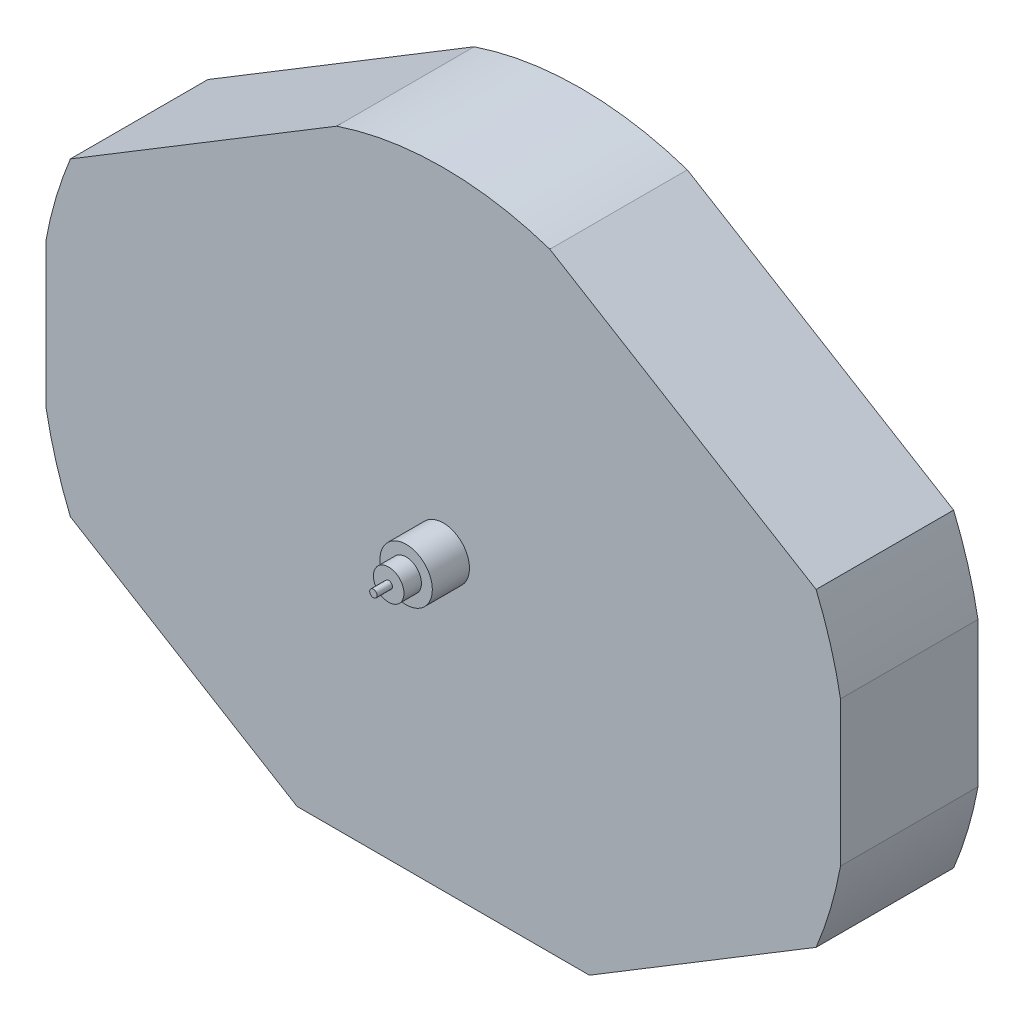
ISO-10303-21;
HEADER;
FILE_DESCRIPTION(('STEP AP214'),'2;1');
FILE_NAME('part.step','',(''),(''),'','','');
FILE_SCHEMA(('AUTOMOTIVE_DESIGN { 1 0 10303 214 1 1 1 1 }'));
ENDSEC;
DATA;
#1=APPLICATION_CONTEXT('core data for automotive mechanical design processes');
#2=APPLICATION_PROTOCOL_DEFINITION('international standard','automotive_design',2000,#1);
#3=PRODUCT_CONTEXT('',#1,'mechanical');
#4=PRODUCT('Part','Part','',(#3));
#5=PRODUCT_RELATED_PRODUCT_CATEGORY('part','',(#4));
#6=PRODUCT_DEFINITION_FORMATION('','',#4);
#7=PRODUCT_DEFINITION_CONTEXT('part definition',#1,'design');
#8=PRODUCT_DEFINITION('design','',#6,#7);
#9=PRODUCT_DEFINITION_SHAPE('','',#8);
#10=(LENGTH_UNIT() NAMED_UNIT(*) SI_UNIT(.MILLI.,.METRE.));
#11=(NAMED_UNIT(*) PLANE_ANGLE_UNIT() SI_UNIT($,.RADIAN.));
#12=(NAMED_UNIT(*) SI_UNIT($,.STERADIAN.) SOLID_ANGLE_UNIT());
#13=UNCERTAINTY_MEASURE_WITH_UNIT(LENGTH_MEASURE(1.E-05),#10,'distance_accuracy_value','');
#14=(GEOMETRIC_REPRESENTATION_CONTEXT(3) GLOBAL_UNCERTAINTY_ASSIGNED_CONTEXT((#13)) GLOBAL_UNIT_ASSIGNED_CONTEXT((#10,
#11,#12)) REPRESENTATION_CONTEXT('',''));
#15=CARTESIAN_POINT('',(0.,0.,0.));
#16=DIRECTION('',(0.,0.,1.));
#17=DIRECTION('',(1.,0.,0.));
#18=AXIS2_PLACEMENT_3D('',#15,#16,#17);
#19=CARTESIAN_POINT('',(0.,0.,3.15));
#20=DIRECTION('',(0.,0.,-1.));
#21=DIRECTION('',(-1.,0.,0.));
#22=AXIS2_PLACEMENT_3D('',#19,#20,#21);
#23=CYLINDRICAL_SURFACE('',#22,9.25);
#24=CARTESIAN_POINT('',(0.,0.,0.));
#25=DIRECTION('',(0.,0.,1.));
#26=DIRECTION('',(1.,0.,0.));
#27=AXIS2_PLACEMENT_3D('',#24,#25,#26);
#28=CIRCLE('',#27,9.25);
#29=CARTESIAN_POINT('',(9.1,1.6590660023037,0.));
#30=VERTEX_POINT('',#29);
#31=CARTESIAN_POINT('',(8.54166260162505,3.55,0.));
#32=VERTEX_POINT('',#31);
#33=EDGE_CURVE('E165',#30,#32,#28,.T.);
#34=ORIENTED_EDGE('',*,*,#33,.T.);
#35=DIRECTION('',(0.,0.,-1.));
#36=VECTOR('',#35,1.);
#37=CARTESIAN_POINT('',(8.54166260162505,3.55,3.15));
#38=LINE('',#37,#36);
#39=CARTESIAN_POINT('',(8.54166260162505,3.55,3.15));
#40=VERTEX_POINT('',#39);
#41=EDGE_CURVE('E45',#40,#32,#38,.T.);
#42=ORIENTED_EDGE('',*,*,#41,.F.);
#43=CARTESIAN_POINT('',(0.,0.,3.15));
#44=DIRECTION('',(0.,0.,1.));
#45=DIRECTION('',(1.,0.,0.));
#46=AXIS2_PLACEMENT_3D('',#43,#44,#45);
#47=CIRCLE('',#46,9.25);
#48=CARTESIAN_POINT('',(9.1,1.6590660023037,3.15));
#49=VERTEX_POINT('',#48);
#50=EDGE_CURVE('E183',#49,#40,#47,.T.);
#51=ORIENTED_EDGE('',*,*,#50,.F.);
#52=DIRECTION('',(0.,0.,-1.));
#53=VECTOR('',#52,1.);
#54=CARTESIAN_POINT('',(9.1,1.6590660023037,3.15));
#55=LINE('',#54,#53);
#56=EDGE_CURVE('E158',#49,#30,#55,.T.);
#57=ORIENTED_EDGE('',*,*,#56,.T.);
#58=EDGE_LOOP('',(#34,#42,#51,#57));
#59=FACE_BOUND('',#58,.T.);
#60=ADVANCED_FACE('F39',(#59),#23,.T.);
#61=CARTESIAN_POINT('',(2.44131112314674,7.25,3.15));
#62=DIRECTION('',(-0.518590479698631,-0.855022756636303,0.));
#63=DIRECTION('',(0.855022756636304,-0.518590479698632,0.));
#64=AXIS2_PLACEMENT_3D('',#61,#62,#63);
#65=PLANE('',#64);
#66=DIRECTION('',(-0.855022756636303,0.518590479698632,0.));
#67=VECTOR('',#66,1.);
#68=CARTESIAN_POINT('',(2.44131112314674,7.25,0.));
#69=LINE('',#68,#67);
#70=CARTESIAN_POINT('',(2.44131112314674,7.25,0.));
#71=VERTEX_POINT('',#70);
#72=EDGE_CURVE('E164',#32,#71,#69,.T.);
#73=ORIENTED_EDGE('',*,*,#72,.T.);
#74=DIRECTION('',(0.,0.,-1.));
#75=VECTOR('',#74,1.);
#76=CARTESIAN_POINT('',(2.44131112314674,7.25,3.15));
#77=LINE('',#76,#75);
#78=CARTESIAN_POINT('',(2.44131112314674,7.25,3.15));
#79=VERTEX_POINT('',#78);
#80=EDGE_CURVE('E206',#79,#71,#77,.T.);
#81=ORIENTED_EDGE('',*,*,#80,.F.);
#82=DIRECTION('',(-0.855022756636303,0.518590479698632,0.));
#83=VECTOR('',#82,1.);
#84=CARTESIAN_POINT('',(2.44131112314674,7.25,3.15));
#85=LINE('',#84,#83);
#86=EDGE_CURVE('E114',#40,#79,#85,.T.);
#87=ORIENTED_EDGE('',*,*,#86,.F.);
#88=ORIENTED_EDGE('',*,*,#41,.T.);
#89=EDGE_LOOP('',(#73,#81,#87,#88));
#90=FACE_BOUND('',#89,.T.);
#91=ADVANCED_FACE('F264',(#90),#65,.F.);
#92=CARTESIAN_POINT('',(0.,0.,3.15));
#93=DIRECTION('',(0.,0.,-1.));
#94=DIRECTION('',(-1.,0.,0.));
#95=AXIS2_PLACEMENT_3D('',#92,#93,#94);
#96=CYLINDRICAL_SURFACE('',#95,7.65);
#97=CARTESIAN_POINT('',(0.,0.,0.));
#98=DIRECTION('',(0.,0.,1.));
#99=DIRECTION('',(1.,0.,0.));
#100=AXIS2_PLACEMENT_3D('',#97,#98,#99);
#101=CIRCLE('',#100,7.65);
#102=CARTESIAN_POINT('',(-2.44131112314674,7.25,0.));
#103=VERTEX_POINT('',#102);
#104=EDGE_CURVE('E169',#71,#103,#101,.T.);
#105=ORIENTED_EDGE('',*,*,#104,.T.);
#106=DIRECTION('',(0.,0.,-1.));
#107=VECTOR('',#106,1.);
#108=CARTESIAN_POINT('',(-2.44131112314674,7.25,3.15));
#109=LINE('',#108,#107);
#110=CARTESIAN_POINT('',(-2.44131112314674,7.25,3.15));
#111=VERTEX_POINT('',#110);
#112=EDGE_CURVE('E204',#111,#103,#109,.T.);
#113=ORIENTED_EDGE('',*,*,#112,.F.);
#114=CARTESIAN_POINT('',(0.,0.,3.15));
#115=DIRECTION('',(0.,0.,1.));
#116=DIRECTION('',(1.,0.,0.));
#117=AXIS2_PLACEMENT_3D('',#114,#115,#116);
#118=CIRCLE('',#117,7.65);
#119=EDGE_CURVE('E226',#79,#111,#118,.T.);
#120=ORIENTED_EDGE('',*,*,#119,.F.);
#121=ORIENTED_EDGE('',*,*,#80,.T.);
#122=EDGE_LOOP('',(#105,#113,#120,#121));
#123=FACE_BOUND('',#122,.T.);
#124=ADVANCED_FACE('F267',(#123),#96,.T.);
#125=CARTESIAN_POINT('',(-2.44131112314674,7.25,3.15));
#126=DIRECTION('',(0.518590479698631,-0.855022756636303,0.));
#127=DIRECTION('',(0.855022756636304,0.518590479698632,0.));
#128=AXIS2_PLACEMENT_3D('',#125,#126,#127);
#129=PLANE('',#128);
#130=DIRECTION('',(-0.855022756636303,-0.518590479698632,0.));
#131=VECTOR('',#130,1.);
#132=CARTESIAN_POINT('',(-2.44131112314674,7.25,0.));
#133=LINE('',#132,#131);
#134=CARTESIAN_POINT('',(-8.54166260162505,3.55,0.));
#135=VERTEX_POINT('',#134);
#136=EDGE_CURVE('E168',#103,#135,#133,.T.);
#137=ORIENTED_EDGE('',*,*,#136,.T.);
#138=DIRECTION('',(0.,0.,-1.));
#139=VECTOR('',#138,1.);
#140=CARTESIAN_POINT('',(-8.54166260162505,3.55,3.15));
#141=LINE('',#140,#139);
#142=CARTESIAN_POINT('',(-8.54166260162505,3.55,3.15));
#143=VERTEX_POINT('',#142);
#144=EDGE_CURVE('E203',#143,#135,#141,.T.);
#145=ORIENTED_EDGE('',*,*,#144,.F.);
#146=DIRECTION('',(-0.855022756636303,-0.518590479698632,0.));
#147=VECTOR('',#146,1.);
#148=CARTESIAN_POINT('',(-2.44131112314674,7.25,3.15));
#149=LINE('',#148,#147);
#150=EDGE_CURVE('E229',#111,#143,#149,.T.);
#151=ORIENTED_EDGE('',*,*,#150,.F.);
#152=ORIENTED_EDGE('',*,*,#112,.T.);
#153=EDGE_LOOP('',(#137,#145,#151,#152));
#154=FACE_BOUND('',#153,.T.);
#155=ADVANCED_FACE('F272',(#154),#129,.F.);
#156=CARTESIAN_POINT('',(0.,0.,3.15));
#157=DIRECTION('',(0.,0.,-1.));
#158=DIRECTION('',(-1.,0.,0.));
#159=AXIS2_PLACEMENT_3D('',#156,#157,#158);
#160=CYLINDRICAL_SURFACE('',#159,9.25);
#161=CARTESIAN_POINT('',(0.,0.,0.));
#162=DIRECTION('',(0.,0.,1.));
#163=DIRECTION('',(-1.,0.,0.));
#164=AXIS2_PLACEMENT_3D('',#161,#162,#163);
#165=CIRCLE('',#164,9.25);
#166=CARTESIAN_POINT('',(-9.1,1.6590660023037,0.));
#167=VERTEX_POINT('',#166);
#168=EDGE_CURVE('E172',#135,#167,#165,.T.);
#169=ORIENTED_EDGE('',*,*,#168,.T.);
#170=DIRECTION('',(0.,0.,-1.));
#171=VECTOR('',#170,1.);
#172=CARTESIAN_POINT('',(-9.1,1.6590660023037,3.15));
#173=LINE('',#172,#171);
#174=CARTESIAN_POINT('',(-9.1,1.6590660023037,3.15));
#175=VERTEX_POINT('',#174);
#176=EDGE_CURVE('E196',#175,#167,#173,.T.);
#177=ORIENTED_EDGE('',*,*,#176,.F.);
#178=CARTESIAN_POINT('',(0.,0.,3.15));
#179=DIRECTION('',(0.,0.,1.));
#180=DIRECTION('',(-1.,0.,0.));
#181=AXIS2_PLACEMENT_3D('',#178,#179,#180);
#182=CIRCLE('',#181,9.25);
#183=EDGE_CURVE('E230',#143,#175,#182,.T.);
#184=ORIENTED_EDGE('',*,*,#183,.F.);
#185=ORIENTED_EDGE('',*,*,#144,.T.);
#186=EDGE_LOOP('',(#169,#177,#184,#185));
#187=FACE_BOUND('',#186,.T.);
#188=ADVANCED_FACE('F279',(#187),#160,.T.);
#189=CARTESIAN_POINT('',(-9.1,1.6590660023037,3.15));
#190=DIRECTION('',(1.,0.,0.));
#191=DIRECTION('',(0.,0.,-1.));
#192=AXIS2_PLACEMENT_3D('',#189,#190,#191);
#193=PLANE('',#192);
#194=DIRECTION('',(0.,-1.,0.));
#195=VECTOR('',#194,1.);
#196=CARTESIAN_POINT('',(-9.1,1.6590660023037,0.));
#197=LINE('',#196,#195);
#198=CARTESIAN_POINT('',(-9.1,-1.6590660023037,0.));
#199=VERTEX_POINT('',#198);
#200=EDGE_CURVE('E173',#167,#199,#197,.T.);
#201=ORIENTED_EDGE('',*,*,#200,.T.);
#202=DIRECTION('',(0.,0.,-1.));
#203=VECTOR('',#202,1.);
#204=CARTESIAN_POINT('',(-9.1,-1.6590660023037,3.15));
#205=LINE('',#204,#203);
#206=CARTESIAN_POINT('',(-9.1,-1.6590660023037,3.15));
#207=VERTEX_POINT('',#206);
#208=EDGE_CURVE('E194',#207,#199,#205,.T.);
#209=ORIENTED_EDGE('',*,*,#208,.F.);
#210=DIRECTION('',(0.,-1.,0.));
#211=VECTOR('',#210,1.);
#212=CARTESIAN_POINT('',(-9.1,1.6590660023037,3.15));
#213=LINE('',#212,#211);
#214=EDGE_CURVE('E235',#175,#207,#213,.T.);
#215=ORIENTED_EDGE('',*,*,#214,.F.);
#216=ORIENTED_EDGE('',*,*,#176,.T.);
#217=EDGE_LOOP('',(#201,#209,#215,#216));
#218=FACE_BOUND('',#217,.T.);
#219=ADVANCED_FACE('F282',(#218),#193,.F.);
#220=CARTESIAN_POINT('',(0.,0.,3.15));
#221=DIRECTION('',(0.,0.,-1.));
#222=DIRECTION('',(-1.,0.,0.));
#223=AXIS2_PLACEMENT_3D('',#220,#221,#222);
#224=CYLINDRICAL_SURFACE('',#223,9.25);
#225=CARTESIAN_POINT('',(0.,0.,0.));
#226=DIRECTION('',(0.,0.,1.));
#227=DIRECTION('',(1.,0.,0.));
#228=AXIS2_PLACEMENT_3D('',#225,#226,#227);
#229=CIRCLE('',#228,9.25);
#230=CARTESIAN_POINT('',(-8.54166260162505,-3.55,0.));
#231=VERTEX_POINT('',#230);
#232=EDGE_CURVE('E176',#199,#231,#229,.T.);
#233=ORIENTED_EDGE('',*,*,#232,.T.);
#234=DIRECTION('',(0.,0.,-1.));
#235=VECTOR('',#234,1.);
#236=CARTESIAN_POINT('',(-8.54166260162505,-3.55,3.15));
#237=LINE('',#236,#235);
#238=CARTESIAN_POINT('',(-8.54166260162505,-3.55,3.15));
#239=VERTEX_POINT('',#238);
#240=EDGE_CURVE('E195',#239,#231,#237,.T.);
#241=ORIENTED_EDGE('',*,*,#240,.F.);
#242=CARTESIAN_POINT('',(0.,0.,3.15));
#243=DIRECTION('',(0.,0.,1.));
#244=DIRECTION('',(1.,0.,0.));
#245=AXIS2_PLACEMENT_3D('',#242,#243,#244);
#246=CIRCLE('',#245,9.25);
#247=EDGE_CURVE('E232',#207,#239,#246,.T.);
#248=ORIENTED_EDGE('',*,*,#247,.F.);
#249=ORIENTED_EDGE('',*,*,#208,.T.);
#250=EDGE_LOOP('',(#233,#241,#248,#249));
#251=FACE_BOUND('',#250,.T.);
#252=ADVANCED_FACE('F286',(#251),#224,.T.);
#253=CARTESIAN_POINT('',(-3.34812012670433,-6.7,3.15));
#254=DIRECTION('',(0.518590479698632,0.855022756636303,0.));
#255=DIRECTION('',(-0.855022756636303,0.518590479698632,0.));
#256=AXIS2_PLACEMENT_3D('',#253,#254,#255);
#257=PLANE('',#256);
#258=DIRECTION('',(0.855022756636303,-0.518590479698632,0.));
#259=VECTOR('',#258,1.);
#260=CARTESIAN_POINT('',(-3.34812012670433,-6.7,0.));
#261=LINE('',#260,#259);
#262=CARTESIAN_POINT('',(-3.34812012670433,-6.7,0.));
#263=VERTEX_POINT('',#262);
#264=EDGE_CURVE('E178',#231,#263,#261,.T.);
#265=ORIENTED_EDGE('',*,*,#264,.T.);
#266=DIRECTION('',(0.,0.,-1.));
#267=VECTOR('',#266,1.);
#268=CARTESIAN_POINT('',(-3.34812012670433,-6.7,3.15));
#269=LINE('',#268,#267);
#270=CARTESIAN_POINT('',(-3.34812012670433,-6.7,3.15));
#271=VERTEX_POINT('',#270);
#272=EDGE_CURVE('E188',#271,#263,#269,.T.);
#273=ORIENTED_EDGE('',*,*,#272,.F.);
#274=DIRECTION('',(0.855022756636303,-0.518590479698632,0.));
#275=VECTOR('',#274,1.);
#276=CARTESIAN_POINT('',(-3.34812012670433,-6.7,3.15));
#277=LINE('',#276,#275);
#278=EDGE_CURVE('E237',#239,#271,#277,.T.);
#279=ORIENTED_EDGE('',*,*,#278,.F.);
#280=ORIENTED_EDGE('',*,*,#240,.T.);
#281=EDGE_LOOP('',(#265,#273,#279,#280));
#282=FACE_BOUND('',#281,.T.);
#283=ADVANCED_FACE('F242',(#282),#257,.F.);
#284=CARTESIAN_POINT('',(-3.34812012670433,-6.7,3.15));
#285=DIRECTION('',(0.,1.,0.));
#286=DIRECTION('',(0.,0.,1.));
#287=AXIS2_PLACEMENT_3D('',#284,#285,#286);
#288=PLANE('',#287);
#289=DIRECTION('',(1.,0.,0.));
#290=VECTOR('',#289,1.);
#291=CARTESIAN_POINT('',(-3.34812012670433,-6.7,0.));
#292=LINE('',#291,#290);
#293=CARTESIAN_POINT('',(3.34812012670433,-6.7,0.));
#294=VERTEX_POINT('',#293);
#295=EDGE_CURVE('E179',#263,#294,#292,.T.);
#296=ORIENTED_EDGE('',*,*,#295,.T.);
#297=DIRECTION('',(0.,0.,-1.));
#298=VECTOR('',#297,1.);
#299=CARTESIAN_POINT('',(3.34812012670433,-6.7,3.15));
#300=LINE('',#299,#298);
#301=CARTESIAN_POINT('',(3.34812012670433,-6.7,3.15));
#302=VERTEX_POINT('',#301);
#303=EDGE_CURVE('E153',#302,#294,#300,.T.);
#304=ORIENTED_EDGE('',*,*,#303,.F.);
#305=DIRECTION('',(1.,0.,0.));
#306=VECTOR('',#305,1.);
#307=CARTESIAN_POINT('',(-3.34812012670433,-6.7,3.15));
#308=LINE('',#307,#306);
#309=EDGE_CURVE('E145',#271,#302,#308,.T.);
#310=ORIENTED_EDGE('',*,*,#309,.F.);
#311=ORIENTED_EDGE('',*,*,#272,.T.);
#312=EDGE_LOOP('',(#296,#304,#310,#311));
#313=FACE_BOUND('',#312,.T.);
#314=ADVANCED_FACE('F246',(#313),#288,.F.);
#315=CARTESIAN_POINT('',(3.34812012670433,-6.7,3.15));
#316=DIRECTION('',(-0.518590479698632,0.855022756636303,0.));
#317=DIRECTION('',(-0.855022756636303,-0.518590479698632,0.));
#318=AXIS2_PLACEMENT_3D('',#315,#316,#317);
#319=PLANE('',#318);
#320=DIRECTION('',(0.855022756636303,0.518590479698632,0.));
#321=VECTOR('',#320,1.);
#322=CARTESIAN_POINT('',(3.34812012670433,-6.7,0.));
#323=LINE('',#322,#321);
#324=CARTESIAN_POINT('',(8.54166260162505,-3.55,0.));
#325=VERTEX_POINT('',#324);
#326=EDGE_CURVE('E155',#294,#325,#323,.T.);
#327=ORIENTED_EDGE('',*,*,#326,.T.);
#328=DIRECTION('',(0.,0.,-1.));
#329=VECTOR('',#328,1.);
#330=CARTESIAN_POINT('',(8.54166260162505,-3.55,3.15));
#331=LINE('',#330,#329);
#332=CARTESIAN_POINT('',(8.54166260162505,-3.55,3.15));
#333=VERTEX_POINT('',#332);
#334=EDGE_CURVE('E149',#333,#325,#331,.T.);
#335=ORIENTED_EDGE('',*,*,#334,.F.);
#336=DIRECTION('',(0.855022756636303,0.518590479698632,0.));
#337=VECTOR('',#336,1.);
#338=CARTESIAN_POINT('',(3.34812012670433,-6.7,3.15));
#339=LINE('',#338,#337);
#340=EDGE_CURVE('E138',#302,#333,#339,.T.);
#341=ORIENTED_EDGE('',*,*,#340,.F.);
#342=ORIENTED_EDGE('',*,*,#303,.T.);
#343=EDGE_LOOP('',(#327,#335,#341,#342));
#344=FACE_BOUND('',#343,.T.);
#345=ADVANCED_FACE('F147',(#344),#319,.F.);
#346=CARTESIAN_POINT('',(0.,0.,3.15));
#347=DIRECTION('',(0.,0.,-1.));
#348=DIRECTION('',(-1.,0.,0.));
#349=AXIS2_PLACEMENT_3D('',#346,#347,#348);
#350=CYLINDRICAL_SURFACE('',#349,9.25);
#351=CARTESIAN_POINT('',(0.,0.,0.));
#352=DIRECTION('',(0.,0.,1.));
#353=DIRECTION('',(-1.,0.,0.));
#354=AXIS2_PLACEMENT_3D('',#351,#352,#353);
#355=CIRCLE('',#354,9.25);
#356=CARTESIAN_POINT('',(9.1,-1.6590660023037,0.));
#357=VERTEX_POINT('',#356);
#358=EDGE_CURVE('E98',#325,#357,#355,.T.);
#359=ORIENTED_EDGE('',*,*,#358,.T.);
#360=DIRECTION('',(0.,0.,-1.));
#361=VECTOR('',#360,1.);
#362=CARTESIAN_POINT('',(9.1,-1.6590660023037,3.15));
#363=LINE('',#362,#361);
#364=CARTESIAN_POINT('',(9.1,-1.6590660023037,3.15));
#365=VERTEX_POINT('',#364);
#366=EDGE_CURVE('E152',#365,#357,#363,.T.);
#367=ORIENTED_EDGE('',*,*,#366,.F.);
#368=CARTESIAN_POINT('',(0.,0.,3.15));
#369=DIRECTION('',(0.,0.,1.));
#370=DIRECTION('',(-1.,0.,0.));
#371=AXIS2_PLACEMENT_3D('',#368,#369,#370);
#372=CIRCLE('',#371,9.25);
#373=EDGE_CURVE('E142',#333,#365,#372,.T.);
#374=ORIENTED_EDGE('',*,*,#373,.F.);
#375=ORIENTED_EDGE('',*,*,#334,.T.);
#376=EDGE_LOOP('',(#359,#367,#374,#375));
#377=FACE_BOUND('',#376,.T.);
#378=ADVANCED_FACE('F156',(#377),#350,.T.);
#379=CARTESIAN_POINT('',(9.1,1.6590660023037,3.15));
#380=DIRECTION('',(-1.,0.,0.));
#381=DIRECTION('',(0.,0.,1.));
#382=AXIS2_PLACEMENT_3D('',#379,#380,#381);
#383=PLANE('',#382);
#384=DIRECTION('',(0.,1.,0.));
#385=VECTOR('',#384,1.);
#386=CARTESIAN_POINT('',(9.1,1.6590660023037,0.));
#387=LINE('',#386,#385);
#388=EDGE_CURVE('E102',#357,#30,#387,.T.);
#389=ORIENTED_EDGE('',*,*,#388,.T.);
#390=ORIENTED_EDGE('',*,*,#56,.F.);
#391=DIRECTION('',(0.,1.,0.));
#392=VECTOR('',#391,1.);
#393=CARTESIAN_POINT('',(9.1,1.6590660023037,3.15));
#394=LINE('',#393,#392);
#395=EDGE_CURVE('E60',#365,#49,#394,.T.);
#396=ORIENTED_EDGE('',*,*,#395,.F.);
#397=ORIENTED_EDGE('',*,*,#366,.T.);
#398=EDGE_LOOP('',(#389,#390,#396,#397));
#399=FACE_BOUND('',#398,.T.);
#400=ADVANCED_FACE('F252',(#399),#383,.F.);
#401=CARTESIAN_POINT('',(0.,0.,3.15));
#402=DIRECTION('',(0.,0.,1.));
#403=DIRECTION('',(1.,0.,0.));
#404=AXIS2_PLACEMENT_3D('',#401,#402,#403);
#405=PLANE('',#404);
#406=CARTESIAN_POINT('',(0.,0.,3.15));
#407=DIRECTION('',(0.,0.,1.));
#408=DIRECTION('',(1.,0.,0.));
#409=AXIS2_PLACEMENT_3D('',#406,#407,#408);
#410=CIRCLE('',#409,0.6);
#411=CARTESIAN_POINT('',(0.6,0.,3.15));
#412=VERTEX_POINT('',#411);
#413=EDGE_CURVE('E222',#412,#412,#410,.T.);
#414=ORIENTED_EDGE('',*,*,#413,.F.);
#415=EDGE_LOOP('',(#414));
#416=FACE_BOUND('',#415,.T.);
#417=ORIENTED_EDGE('',*,*,#50,.T.);
#418=ORIENTED_EDGE('',*,*,#86,.T.);
#419=ORIENTED_EDGE('',*,*,#119,.T.);
#420=ORIENTED_EDGE('',*,*,#150,.T.);
#421=ORIENTED_EDGE('',*,*,#183,.T.);
#422=ORIENTED_EDGE('',*,*,#214,.T.);
#423=ORIENTED_EDGE('',*,*,#247,.T.);
#424=ORIENTED_EDGE('',*,*,#278,.T.);
#425=ORIENTED_EDGE('',*,*,#309,.T.);
#426=ORIENTED_EDGE('',*,*,#340,.T.);
#427=ORIENTED_EDGE('',*,*,#373,.T.);
#428=ORIENTED_EDGE('',*,*,#395,.T.);
#429=EDGE_LOOP('',(#417,#418,#419,#420,#421,#422,#423,#424,#425,#426,#427,#428));
#430=FACE_BOUND('',#429,.T.);
#431=ADVANCED_FACE('F139',(#416,#430),#405,.T.);
#432=CARTESIAN_POINT('',(0.,0.,0.));
#433=DIRECTION('',(0.,0.,1.));
#434=DIRECTION('',(1.,0.,0.));
#435=AXIS2_PLACEMENT_3D('',#432,#433,#434);
#436=PLANE('',#435);
#437=ORIENTED_EDGE('',*,*,#33,.F.);
#438=ORIENTED_EDGE('',*,*,#388,.F.);
#439=ORIENTED_EDGE('',*,*,#358,.F.);
#440=ORIENTED_EDGE('',*,*,#326,.F.);
#441=ORIENTED_EDGE('',*,*,#295,.F.);
#442=ORIENTED_EDGE('',*,*,#264,.F.);
#443=ORIENTED_EDGE('',*,*,#232,.F.);
#444=ORIENTED_EDGE('',*,*,#200,.F.);
#445=ORIENTED_EDGE('',*,*,#168,.F.);
#446=ORIENTED_EDGE('',*,*,#136,.F.);
#447=ORIENTED_EDGE('',*,*,#104,.F.);
#448=ORIENTED_EDGE('',*,*,#72,.F.);
#449=EDGE_LOOP('',(#437,#438,#439,#440,#441,#442,#443,#444,#445,#446,#447,#448));
#450=FACE_BOUND('',#449,.T.);
#451=ADVANCED_FACE('F247',(#450),#436,.F.);
#452=CARTESIAN_POINT('',(0.,0.,4.));
#453=DIRECTION('',(0.,0.,-1.));
#454=DIRECTION('',(-1.,0.,0.));
#455=AXIS2_PLACEMENT_3D('',#452,#453,#454);
#456=CYLINDRICAL_SURFACE('',#455,0.6);
#457=CARTESIAN_POINT('',(0.,0.,4.));
#458=DIRECTION('',(0.,0.,1.));
#459=DIRECTION('',(1.,0.,0.));
#460=AXIS2_PLACEMENT_3D('',#457,#458,#459);
#461=CIRCLE('',#460,0.6);
#462=CARTESIAN_POINT('',(0.6,0.,4.));
#463=VERTEX_POINT('',#462);
#464=EDGE_CURVE('E167',#463,#463,#461,.T.);
#465=ORIENTED_EDGE('',*,*,#464,.F.);
#466=EDGE_LOOP('',(#465));
#467=FACE_BOUND('',#466,.T.);
#468=ORIENTED_EDGE('',*,*,#413,.T.);
#469=EDGE_LOOP('',(#468));
#470=FACE_BOUND('',#469,.T.);
#471=ADVANCED_FACE('F324',(#467,#470),#456,.T.);
#472=CARTESIAN_POINT('',(0.,0.,4.));
#473=DIRECTION('',(0.,0.,1.));
#474=DIRECTION('',(1.,0.,0.));
#475=AXIS2_PLACEMENT_3D('',#472,#473,#474);
#476=PLANE('',#475);
#477=CARTESIAN_POINT('',(0.,0.,4.));
#478=DIRECTION('',(0.,0.,1.));
#479=DIRECTION('',(1.,0.,0.));
#480=AXIS2_PLACEMENT_3D('',#477,#478,#479);
#481=CIRCLE('',#480,0.35);
#482=CARTESIAN_POINT('',(0.35,0.,4.));
#483=VERTEX_POINT('',#482);
#484=EDGE_CURVE('E48',#483,#483,#481,.T.);
#485=ORIENTED_EDGE('',*,*,#484,.F.);
#486=EDGE_LOOP('',(#485));
#487=FACE_BOUND('',#486,.T.);
#488=ORIENTED_EDGE('',*,*,#464,.T.);
#489=EDGE_LOOP('',(#488));
#490=FACE_BOUND('',#489,.T.);
#491=ADVANCED_FACE('F335',(#487,#490),#476,.T.);
#492=CARTESIAN_POINT('',(0.,0.,4.4));
#493=DIRECTION('',(0.,0.,-1.));
#494=DIRECTION('',(-1.,0.,0.));
#495=AXIS2_PLACEMENT_3D('',#492,#493,#494);
#496=CYLINDRICAL_SURFACE('',#495,0.35);
#497=CARTESIAN_POINT('',(0.,0.,4.4));
#498=DIRECTION('',(0.,0.,1.));
#499=DIRECTION('',(1.,0.,0.));
#500=AXIS2_PLACEMENT_3D('',#497,#498,#499);
#501=CIRCLE('',#500,0.35);
#502=CARTESIAN_POINT('',(0.35,0.,4.4));
#503=VERTEX_POINT('',#502);
#504=EDGE_CURVE('E217',#503,#503,#501,.T.);
#505=ORIENTED_EDGE('',*,*,#504,.F.);
#506=EDGE_LOOP('',(#505));
#507=FACE_BOUND('',#506,.T.);
#508=ORIENTED_EDGE('',*,*,#484,.T.);
#509=EDGE_LOOP('',(#508));
#510=FACE_BOUND('',#509,.T.);
#511=ADVANCED_FACE('F345',(#507,#510),#496,.T.);
#512=CARTESIAN_POINT('',(0.,0.,4.4));
#513=DIRECTION('',(0.,0.,1.));
#514=DIRECTION('',(1.,0.,0.));
#515=AXIS2_PLACEMENT_3D('',#512,#513,#514);
#516=PLANE('',#515);
#517=CARTESIAN_POINT('',(0.,0.,4.4));
#518=DIRECTION('',(0.,0.,1.));
#519=DIRECTION('',(1.,0.,0.));
#520=AXIS2_PLACEMENT_3D('',#517,#518,#519);
#521=CIRCLE('',#520,0.085);
#522=CARTESIAN_POINT('',(0.085,0.,4.4));
#523=VERTEX_POINT('',#522);
#524=EDGE_CURVE('E11',#523,#523,#521,.T.);
#525=ORIENTED_EDGE('',*,*,#524,.F.);
#526=EDGE_LOOP('',(#525));
#527=FACE_BOUND('',#526,.T.);
#528=ORIENTED_EDGE('',*,*,#504,.T.);
#529=EDGE_LOOP('',(#528));
#530=FACE_BOUND('',#529,.T.);
#531=ADVANCED_FACE('F352',(#527,#530),#516,.T.);
#532=CARTESIAN_POINT('',(0.,0.,4.75));
#533=DIRECTION('',(0.,0.,-1.));
#534=DIRECTION('',(-1.,0.,0.));
#535=AXIS2_PLACEMENT_3D('',#532,#533,#534);
#536=CYLINDRICAL_SURFACE('',#535,0.085);
#537=CARTESIAN_POINT('',(0.,0.,4.75));
#538=DIRECTION('',(0.,0.,1.));
#539=DIRECTION('',(1.,0.,0.));
#540=AXIS2_PLACEMENT_3D('',#537,#538,#539);
#541=CIRCLE('',#540,0.085);
#542=CARTESIAN_POINT('',(0.085,0.,4.75));
#543=VERTEX_POINT('',#542);
#544=EDGE_CURVE('E390',#543,#543,#541,.T.);
#545=ORIENTED_EDGE('',*,*,#544,.F.);
#546=EDGE_LOOP('',(#545));
#547=FACE_BOUND('',#546,.T.);
#548=ORIENTED_EDGE('',*,*,#524,.T.);
#549=EDGE_LOOP('',(#548));
#550=FACE_BOUND('',#549,.T.);
#551=ADVANCED_FACE('F362',(#547,#550),#536,.T.);
#552=CARTESIAN_POINT('',(0.,0.,4.75));
#553=DIRECTION('',(0.,0.,1.));
#554=DIRECTION('',(1.,0.,0.));
#555=AXIS2_PLACEMENT_3D('',#552,#553,#554);
#556=PLANE('',#555);
#557=ORIENTED_EDGE('',*,*,#544,.T.);
#558=EDGE_LOOP('',(#557));
#559=FACE_BOUND('',#558,.T.);
#560=ADVANCED_FACE('F375',(#559),#556,.T.);
#561=CLOSED_SHELL('',(#60,#91,#124,#155,#188,#219,#252,#283,#314,#345,#378,#400,#431,#451,#471,
#491,#511,#531,#551,#560));
#562=MANIFOLD_SOLID_BREP('B2',#561);
#563=ADVANCED_BREP_SHAPE_REPRESENTATION('',(#18,#562),#14);
#564=SHAPE_DEFINITION_REPRESENTATION(#9,#563);
ENDSEC;
END-ISO-10303-21;
